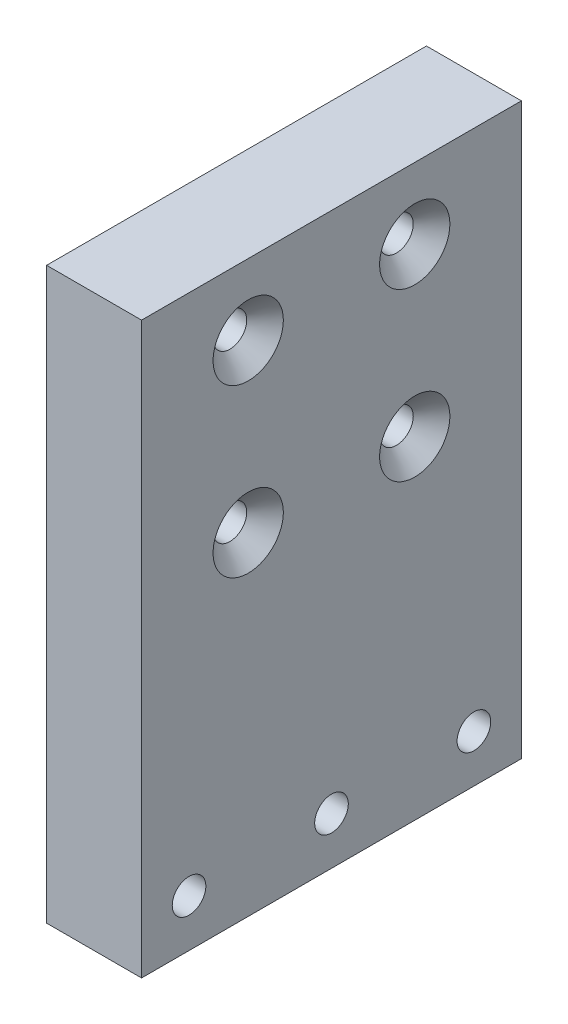
ISO-10303-21;
HEADER;
FILE_DESCRIPTION(('STEP AP214'),'2;1');
FILE_NAME('part.step','',(''),(''),'','','');
FILE_SCHEMA(('AUTOMOTIVE_DESIGN { 1 0 10303 214 1 1 1 1 }'));
ENDSEC;
DATA;
#1=APPLICATION_CONTEXT('core data for automotive mechanical design processes');
#2=APPLICATION_PROTOCOL_DEFINITION('international standard','automotive_design',2000,#1);
#3=PRODUCT_CONTEXT('',#1,'mechanical');
#4=PRODUCT('Part','Part','',(#3));
#5=PRODUCT_RELATED_PRODUCT_CATEGORY('part','',(#4));
#6=PRODUCT_DEFINITION_FORMATION('','',#4);
#7=PRODUCT_DEFINITION_CONTEXT('part definition',#1,'design');
#8=PRODUCT_DEFINITION('design','',#6,#7);
#9=PRODUCT_DEFINITION_SHAPE('','',#8);
#10=(LENGTH_UNIT() NAMED_UNIT(*) SI_UNIT(.MILLI.,.METRE.));
#11=(NAMED_UNIT(*) PLANE_ANGLE_UNIT() SI_UNIT($,.RADIAN.));
#12=(NAMED_UNIT(*) SI_UNIT($,.STERADIAN.) SOLID_ANGLE_UNIT());
#13=UNCERTAINTY_MEASURE_WITH_UNIT(LENGTH_MEASURE(1.E-05),#10,'distance_accuracy_value','');
#14=(GEOMETRIC_REPRESENTATION_CONTEXT(3) GLOBAL_UNCERTAINTY_ASSIGNED_CONTEXT((#13)) GLOBAL_UNIT_ASSIGNED_CONTEXT((#10,
#11,#12)) REPRESENTATION_CONTEXT('',''));
#15=CARTESIAN_POINT('',(0.,0.,0.));
#16=DIRECTION('',(0.,0.,1.));
#17=DIRECTION('',(1.,0.,0.));
#18=AXIS2_PLACEMENT_3D('',#15,#16,#17);
#19=CARTESIAN_POINT('',(12.7,-38.1,-25.4));
#20=DIRECTION('',(0.,0.,1.));
#21=DIRECTION('',(1.,0.,0.));
#22=AXIS2_PLACEMENT_3D('',#19,#20,#21);
#23=PLANE('',#22);
#24=DIRECTION('',(0.,1.,0.));
#25=VECTOR('',#24,1.);
#26=CARTESIAN_POINT('',(0.,-38.1,-25.4));
#27=LINE('',#26,#25);
#28=CARTESIAN_POINT('',(0.,-38.1,-25.4));
#29=VERTEX_POINT('',#28);
#30=CARTESIAN_POINT('',(0.,38.1,-25.4));
#31=VERTEX_POINT('',#30);
#32=EDGE_CURVE('E96',#29,#31,#27,.T.);
#33=ORIENTED_EDGE('',*,*,#32,.T.);
#34=DIRECTION('',(-1.,0.,0.));
#35=VECTOR('',#34,1.);
#36=CARTESIAN_POINT('',(12.7,38.1,-25.4));
#37=LINE('',#36,#35);
#38=CARTESIAN_POINT('',(12.7,38.1,-25.4));
#39=VERTEX_POINT('',#38);
#40=EDGE_CURVE('E11',#39,#31,#37,.T.);
#41=ORIENTED_EDGE('',*,*,#40,.F.);
#42=DIRECTION('',(0.,1.,0.));
#43=VECTOR('',#42,1.);
#44=CARTESIAN_POINT('',(12.7,-38.1,-25.4));
#45=LINE('',#44,#43);
#46=CARTESIAN_POINT('',(12.7,-38.1,-25.4));
#47=VERTEX_POINT('',#46);
#48=EDGE_CURVE('E84',#47,#39,#45,.T.);
#49=ORIENTED_EDGE('',*,*,#48,.F.);
#50=DIRECTION('',(-1.,0.,0.));
#51=VECTOR('',#50,1.);
#52=CARTESIAN_POINT('',(12.7,-38.1,-25.4));
#53=LINE('',#52,#51);
#54=EDGE_CURVE('E92',#47,#29,#53,.T.);
#55=ORIENTED_EDGE('',*,*,#54,.T.);
#56=EDGE_LOOP('',(#33,#41,#49,#55));
#57=FACE_BOUND('',#56,.T.);
#58=ADVANCED_FACE('F33',(#57),#23,.F.);
#59=CARTESIAN_POINT('',(12.7,38.1,25.4));
#60=DIRECTION('',(0.,-1.,0.));
#61=DIRECTION('',(0.,0.,-1.));
#62=AXIS2_PLACEMENT_3D('',#59,#60,#61);
#63=PLANE('',#62);
#64=DIRECTION('',(0.,0.,1.));
#65=VECTOR('',#64,1.);
#66=CARTESIAN_POINT('',(0.,38.1,25.4));
#67=LINE('',#66,#65);
#68=CARTESIAN_POINT('',(0.,38.1,25.4));
#69=VERTEX_POINT('',#68);
#70=EDGE_CURVE('E88',#31,#69,#67,.T.);
#71=ORIENTED_EDGE('',*,*,#70,.T.);
#72=DIRECTION('',(-1.,0.,0.));
#73=VECTOR('',#72,1.);
#74=CARTESIAN_POINT('',(12.7,38.1,25.4));
#75=LINE('',#74,#73);
#76=CARTESIAN_POINT('',(12.7,38.1,25.4));
#77=VERTEX_POINT('',#76);
#78=EDGE_CURVE('E41',#77,#69,#75,.T.);
#79=ORIENTED_EDGE('',*,*,#78,.F.);
#80=DIRECTION('',(0.,0.,1.));
#81=VECTOR('',#80,1.);
#82=CARTESIAN_POINT('',(12.7,38.1,25.4));
#83=LINE('',#82,#81);
#84=EDGE_CURVE('E79',#39,#77,#83,.T.);
#85=ORIENTED_EDGE('',*,*,#84,.F.);
#86=ORIENTED_EDGE('',*,*,#40,.T.);
#87=EDGE_LOOP('',(#71,#79,#85,#86));
#88=FACE_BOUND('',#87,.T.);
#89=ADVANCED_FACE('F87',(#88),#63,.F.);
#90=CARTESIAN_POINT('',(12.7,-38.1,25.4));
#91=DIRECTION('',(0.,0.,-1.));
#92=DIRECTION('',(-1.,0.,0.));
#93=AXIS2_PLACEMENT_3D('',#90,#91,#92);
#94=PLANE('',#93);
#95=DIRECTION('',(0.,-1.,0.));
#96=VECTOR('',#95,1.);
#97=CARTESIAN_POINT('',(0.,-38.1,25.4));
#98=LINE('',#97,#96);
#99=CARTESIAN_POINT('',(0.,-38.1,25.4));
#100=VERTEX_POINT('',#99);
#101=EDGE_CURVE('E66',#69,#100,#98,.T.);
#102=ORIENTED_EDGE('',*,*,#101,.T.);
#103=DIRECTION('',(-1.,0.,0.));
#104=VECTOR('',#103,1.);
#105=CARTESIAN_POINT('',(12.7,-38.1,25.4));
#106=LINE('',#105,#104);
#107=CARTESIAN_POINT('',(12.7,-38.1,25.4));
#108=VERTEX_POINT('',#107);
#109=EDGE_CURVE('E89',#108,#100,#106,.T.);
#110=ORIENTED_EDGE('',*,*,#109,.F.);
#111=DIRECTION('',(0.,-1.,0.));
#112=VECTOR('',#111,1.);
#113=CARTESIAN_POINT('',(12.7,-38.1,25.4));
#114=LINE('',#113,#112);
#115=EDGE_CURVE('E82',#77,#108,#114,.T.);
#116=ORIENTED_EDGE('',*,*,#115,.F.);
#117=ORIENTED_EDGE('',*,*,#78,.T.);
#118=EDGE_LOOP('',(#102,#110,#116,#117));
#119=FACE_BOUND('',#118,.T.);
#120=ADVANCED_FACE('F90',(#119),#94,.F.);
#121=CARTESIAN_POINT('',(12.7,-38.1,25.4));
#122=DIRECTION('',(0.,1.,0.));
#123=DIRECTION('',(0.,0.,1.));
#124=AXIS2_PLACEMENT_3D('',#121,#122,#123);
#125=PLANE('',#124);
#126=DIRECTION('',(0.,0.,-1.));
#127=VECTOR('',#126,1.);
#128=CARTESIAN_POINT('',(0.,-38.1,25.4));
#129=LINE('',#128,#127);
#130=EDGE_CURVE('E72',#100,#29,#129,.T.);
#131=ORIENTED_EDGE('',*,*,#130,.T.);
#132=ORIENTED_EDGE('',*,*,#54,.F.);
#133=DIRECTION('',(0.,0.,-1.));
#134=VECTOR('',#133,1.);
#135=CARTESIAN_POINT('',(12.7,-38.1,25.4));
#136=LINE('',#135,#134);
#137=EDGE_CURVE('E49',#108,#47,#136,.T.);
#138=ORIENTED_EDGE('',*,*,#137,.F.);
#139=ORIENTED_EDGE('',*,*,#109,.T.);
#140=EDGE_LOOP('',(#131,#132,#138,#139));
#141=FACE_BOUND('',#140,.T.);
#142=ADVANCED_FACE('F104',(#141),#125,.F.);
#143=CARTESIAN_POINT('',(12.7,0.,0.));
#144=DIRECTION('',(-1.,0.,0.));
#145=DIRECTION('',(0.,0.,1.));
#146=AXIS2_PLACEMENT_3D('',#143,#144,#145);
#147=PLANE('',#146);
#148=CARTESIAN_POINT('',(12.7,-31.75,-19.05));
#149=DIRECTION('',(-1.,0.,0.));
#150=DIRECTION('',(0.,0.,1.));
#151=AXIS2_PLACEMENT_3D('',#148,#149,#150);
#152=CIRCLE('',#151,2.24790000000001);
#153=CARTESIAN_POINT('',(12.7,-31.75,-16.8021));
#154=VERTEX_POINT('',#153);
#155=EDGE_CURVE('E169',#154,#154,#152,.T.);
#156=ORIENTED_EDGE('',*,*,#155,.T.);
#157=EDGE_LOOP('',(#156));
#158=FACE_BOUND('',#157,.T.);
#159=CARTESIAN_POINT('',(12.7,-31.75,0.));
#160=DIRECTION('',(-1.,0.,0.));
#161=DIRECTION('',(0.,0.,1.));
#162=AXIS2_PLACEMENT_3D('',#159,#160,#161);
#163=CIRCLE('',#162,2.24790000000001);
#164=CARTESIAN_POINT('',(12.7,-31.75,2.24790000000001));
#165=VERTEX_POINT('',#164);
#166=EDGE_CURVE('E157',#165,#165,#163,.T.);
#167=ORIENTED_EDGE('',*,*,#166,.T.);
#168=EDGE_LOOP('',(#167));
#169=FACE_BOUND('',#168,.T.);
#170=CARTESIAN_POINT('',(12.7,-31.75,19.05));
#171=DIRECTION('',(-1.,0.,0.));
#172=DIRECTION('',(0.,0.,1.));
#173=AXIS2_PLACEMENT_3D('',#170,#171,#172);
#174=CIRCLE('',#173,2.24790000000001);
#175=CARTESIAN_POINT('',(12.7,-31.75,21.2979));
#176=VERTEX_POINT('',#175);
#177=EDGE_CURVE('E145',#176,#176,#174,.T.);
#178=ORIENTED_EDGE('',*,*,#177,.T.);
#179=EDGE_LOOP('',(#178));
#180=FACE_BOUND('',#179,.T.);
#181=CARTESIAN_POINT('',(12.7,28.6238636073763,-11.1369318036881));
#182=DIRECTION('',(1.,0.,0.));
#183=DIRECTION('',(0.,0.,-1.));
#184=AXIS2_PLACEMENT_3D('',#181,#182,#183);
#185=CIRCLE('',#184,4.7);
#186=CARTESIAN_POINT('',(12.7,28.6238636073763,-15.8369318036881));
#187=VERTEX_POINT('',#186);
#188=EDGE_CURVE('E142',#187,#187,#185,.T.);
#189=ORIENTED_EDGE('',*,*,#188,.F.);
#190=EDGE_LOOP('',(#189));
#191=FACE_BOUND('',#190,.T.);
#192=CARTESIAN_POINT('',(12.7,28.6238636073763,11.1369318036881));
#193=DIRECTION('',(1.,0.,0.));
#194=DIRECTION('',(0.,0.,-1.));
#195=AXIS2_PLACEMENT_3D('',#192,#193,#194);
#196=CIRCLE('',#195,4.7);
#197=CARTESIAN_POINT('',(12.7,28.6238636073763,6.43693180368812));
#198=VERTEX_POINT('',#197);
#199=EDGE_CURVE('E133',#198,#198,#196,.T.);
#200=ORIENTED_EDGE('',*,*,#199,.F.);
#201=EDGE_LOOP('',(#200));
#202=FACE_BOUND('',#201,.T.);
#203=CARTESIAN_POINT('',(12.7,6.35000000000001,11.1369318036881));
#204=DIRECTION('',(1.,0.,0.));
#205=DIRECTION('',(0.,0.,-1.));
#206=AXIS2_PLACEMENT_3D('',#203,#204,#205);
#207=CIRCLE('',#206,4.7);
#208=CARTESIAN_POINT('',(12.7,6.35000000000001,6.43693180368812));
#209=VERTEX_POINT('',#208);
#210=EDGE_CURVE('E124',#209,#209,#207,.T.);
#211=ORIENTED_EDGE('',*,*,#210,.F.);
#212=EDGE_LOOP('',(#211));
#213=FACE_BOUND('',#212,.T.);
#214=CARTESIAN_POINT('',(12.7,6.35000000000001,-11.1369318036881));
#215=DIRECTION('',(1.,0.,0.));
#216=DIRECTION('',(0.,0.,-1.));
#217=AXIS2_PLACEMENT_3D('',#214,#215,#216);
#218=CIRCLE('',#217,4.7);
#219=CARTESIAN_POINT('',(12.7,6.35000000000001,-15.8369318036881));
#220=VERTEX_POINT('',#219);
#221=EDGE_CURVE('E115',#220,#220,#218,.T.);
#222=ORIENTED_EDGE('',*,*,#221,.F.);
#223=EDGE_LOOP('',(#222));
#224=FACE_BOUND('',#223,.T.);
#225=ORIENTED_EDGE('',*,*,#48,.T.);
#226=ORIENTED_EDGE('',*,*,#84,.T.);
#227=ORIENTED_EDGE('',*,*,#115,.T.);
#228=ORIENTED_EDGE('',*,*,#137,.T.);
#229=EDGE_LOOP('',(#225,#226,#227,#228));
#230=FACE_BOUND('',#229,.T.);
#231=ADVANCED_FACE('F80',(#158,#169,#180,#191,#202,#213,#224,#230),#147,.F.);
#232=CARTESIAN_POINT('',(0.,0.,0.));
#233=DIRECTION('',(-1.,0.,0.));
#234=DIRECTION('',(0.,0.,1.));
#235=AXIS2_PLACEMENT_3D('',#232,#233,#234);
#236=PLANE('',#235);
#237=CARTESIAN_POINT('',(0.,-31.75,-19.05));
#238=DIRECTION('',(-1.,0.,0.));
#239=DIRECTION('',(0.,0.,1.));
#240=AXIS2_PLACEMENT_3D('',#237,#238,#239);
#241=CIRCLE('',#240,4.76249999999999);
#242=CARTESIAN_POINT('',(0.,-31.75,-14.2875));
#243=VERTEX_POINT('',#242);
#244=EDGE_CURVE('E178',#243,#243,#241,.T.);
#245=ORIENTED_EDGE('',*,*,#244,.F.);
#246=EDGE_LOOP('',(#245));
#247=FACE_BOUND('',#246,.T.);
#248=CARTESIAN_POINT('',(0.,-31.75,0.));
#249=DIRECTION('',(-1.,0.,0.));
#250=DIRECTION('',(0.,0.,1.));
#251=AXIS2_PLACEMENT_3D('',#248,#249,#250);
#252=CIRCLE('',#251,4.76249999999999);
#253=CARTESIAN_POINT('',(0.,-31.75,4.76249999999999));
#254=VERTEX_POINT('',#253);
#255=EDGE_CURVE('E166',#254,#254,#252,.T.);
#256=ORIENTED_EDGE('',*,*,#255,.F.);
#257=EDGE_LOOP('',(#256));
#258=FACE_BOUND('',#257,.T.);
#259=CARTESIAN_POINT('',(0.,-31.75,19.05));
#260=DIRECTION('',(-1.,0.,0.));
#261=DIRECTION('',(0.,0.,1.));
#262=AXIS2_PLACEMENT_3D('',#259,#260,#261);
#263=CIRCLE('',#262,4.76249999999999);
#264=CARTESIAN_POINT('',(0.,-31.75,23.8125));
#265=VERTEX_POINT('',#264);
#266=EDGE_CURVE('E154',#265,#265,#263,.T.);
#267=ORIENTED_EDGE('',*,*,#266,.F.);
#268=EDGE_LOOP('',(#267));
#269=FACE_BOUND('',#268,.T.);
#270=CARTESIAN_POINT('',(0.,28.6238636073763,-11.1369318036881));
#271=DIRECTION('',(1.,0.,0.));
#272=DIRECTION('',(0.,0.,-1.));
#273=AXIS2_PLACEMENT_3D('',#270,#271,#272);
#274=CIRCLE('',#273,2.25);
#275=CARTESIAN_POINT('',(0.,28.6238636073763,-13.3869318036881));
#276=VERTEX_POINT('',#275);
#277=EDGE_CURVE('E136',#276,#276,#274,.T.);
#278=ORIENTED_EDGE('',*,*,#277,.T.);
#279=EDGE_LOOP('',(#278));
#280=FACE_BOUND('',#279,.T.);
#281=CARTESIAN_POINT('',(0.,28.6238636073763,11.1369318036881));
#282=DIRECTION('',(1.,0.,0.));
#283=DIRECTION('',(0.,0.,-1.));
#284=AXIS2_PLACEMENT_3D('',#281,#282,#283);
#285=CIRCLE('',#284,2.25);
#286=CARTESIAN_POINT('',(0.,28.6238636073763,8.88693180368812));
#287=VERTEX_POINT('',#286);
#288=EDGE_CURVE('E127',#287,#287,#285,.T.);
#289=ORIENTED_EDGE('',*,*,#288,.T.);
#290=EDGE_LOOP('',(#289));
#291=FACE_BOUND('',#290,.T.);
#292=CARTESIAN_POINT('',(0.,6.35000000000001,11.1369318036881));
#293=DIRECTION('',(1.,0.,0.));
#294=DIRECTION('',(0.,0.,-1.));
#295=AXIS2_PLACEMENT_3D('',#292,#293,#294);
#296=CIRCLE('',#295,2.25);
#297=CARTESIAN_POINT('',(0.,6.35000000000001,8.88693180368812));
#298=VERTEX_POINT('',#297);
#299=EDGE_CURVE('E118',#298,#298,#296,.T.);
#300=ORIENTED_EDGE('',*,*,#299,.T.);
#301=EDGE_LOOP('',(#300));
#302=FACE_BOUND('',#301,.T.);
#303=CARTESIAN_POINT('',(0.,6.35000000000001,-11.1369318036881));
#304=DIRECTION('',(1.,0.,0.));
#305=DIRECTION('',(0.,0.,-1.));
#306=AXIS2_PLACEMENT_3D('',#303,#304,#305);
#307=CIRCLE('',#306,2.25);
#308=CARTESIAN_POINT('',(0.,6.35000000000001,-13.3869318036881));
#309=VERTEX_POINT('',#308);
#310=EDGE_CURVE('E99',#309,#309,#307,.T.);
#311=ORIENTED_EDGE('',*,*,#310,.T.);
#312=EDGE_LOOP('',(#311));
#313=FACE_BOUND('',#312,.T.);
#314=ORIENTED_EDGE('',*,*,#32,.F.);
#315=ORIENTED_EDGE('',*,*,#130,.F.);
#316=ORIENTED_EDGE('',*,*,#101,.F.);
#317=ORIENTED_EDGE('',*,*,#70,.F.);
#318=EDGE_LOOP('',(#314,#315,#316,#317));
#319=FACE_BOUND('',#318,.T.);
#320=ADVANCED_FACE('F107',(#247,#258,#269,#280,#291,#302,#313,#319),#236,.T.);
#321=CARTESIAN_POINT('',(12.7,6.35000000000001,-11.1369318036881));
#322=DIRECTION('',(1.,0.,0.));
#323=DIRECTION('',(0.,0.,-1.));
#324=AXIS2_PLACEMENT_3D('',#321,#322,#323);
#325=CYLINDRICAL_SURFACE('',#324,2.25);
#326=ORIENTED_EDGE('',*,*,#310,.F.);
#327=EDGE_LOOP('',(#326));
#328=FACE_BOUND('',#327,.T.);
#329=CARTESIAN_POINT('',(10.25,6.35000000000001,-11.1369318036881));
#330=DIRECTION('',(1.,0.,0.));
#331=DIRECTION('',(0.,0.,-1.));
#332=AXIS2_PLACEMENT_3D('',#329,#330,#331);
#333=CIRCLE('',#332,2.25);
#334=CARTESIAN_POINT('',(10.25,6.35000000000001,-13.3869318036881));
#335=VERTEX_POINT('',#334);
#336=EDGE_CURVE('E112',#335,#335,#333,.T.);
#337=ORIENTED_EDGE('',*,*,#336,.T.);
#338=EDGE_LOOP('',(#337));
#339=FACE_BOUND('',#338,.T.);
#340=ADVANCED_FACE('F186',(#328,#339),#325,.F.);
#341=CARTESIAN_POINT('',(12.7,6.35000000000001,-11.1369318036881));
#342=DIRECTION('',(1.,0.,0.));
#343=DIRECTION('',(0.,0.,-1.));
#344=AXIS2_PLACEMENT_3D('',#341,#342,#343);
#345=CONICAL_SURFACE('',#344,4.7,0.785398163397448);
#346=ORIENTED_EDGE('',*,*,#336,.F.);
#347=EDGE_LOOP('',(#346));
#348=FACE_BOUND('',#347,.T.);
#349=ORIENTED_EDGE('',*,*,#221,.T.);
#350=EDGE_LOOP('',(#349));
#351=FACE_BOUND('',#350,.T.);
#352=ADVANCED_FACE('F202',(#348,#351),#345,.F.);
#353=CARTESIAN_POINT('',(12.7,6.35000000000001,11.1369318036881));
#354=DIRECTION('',(1.,0.,0.));
#355=DIRECTION('',(0.,0.,-1.));
#356=AXIS2_PLACEMENT_3D('',#353,#354,#355);
#357=CYLINDRICAL_SURFACE('',#356,2.25);
#358=ORIENTED_EDGE('',*,*,#299,.F.);
#359=EDGE_LOOP('',(#358));
#360=FACE_BOUND('',#359,.T.);
#361=CARTESIAN_POINT('',(10.25,6.35000000000001,11.1369318036881));
#362=DIRECTION('',(1.,0.,0.));
#363=DIRECTION('',(0.,0.,-1.));
#364=AXIS2_PLACEMENT_3D('',#361,#362,#363);
#365=CIRCLE('',#364,2.25);
#366=CARTESIAN_POINT('',(10.25,6.35000000000001,8.88693180368812));
#367=VERTEX_POINT('',#366);
#368=EDGE_CURVE('E121',#367,#367,#365,.T.);
#369=ORIENTED_EDGE('',*,*,#368,.T.);
#370=EDGE_LOOP('',(#369));
#371=FACE_BOUND('',#370,.T.);
#372=ADVANCED_FACE('F208',(#360,#371),#357,.F.);
#373=CARTESIAN_POINT('',(12.7,6.35000000000001,11.1369318036881));
#374=DIRECTION('',(1.,0.,0.));
#375=DIRECTION('',(0.,0.,-1.));
#376=AXIS2_PLACEMENT_3D('',#373,#374,#375);
#377=CONICAL_SURFACE('',#376,4.7,0.785398163397448);
#378=ORIENTED_EDGE('',*,*,#368,.F.);
#379=EDGE_LOOP('',(#378));
#380=FACE_BOUND('',#379,.T.);
#381=ORIENTED_EDGE('',*,*,#210,.T.);
#382=EDGE_LOOP('',(#381));
#383=FACE_BOUND('',#382,.T.);
#384=ADVANCED_FACE('F257',(#380,#383),#377,.F.);
#385=CARTESIAN_POINT('',(12.7,28.6238636073763,11.1369318036881));
#386=DIRECTION('',(1.,0.,0.));
#387=DIRECTION('',(0.,0.,-1.));
#388=AXIS2_PLACEMENT_3D('',#385,#386,#387);
#389=CYLINDRICAL_SURFACE('',#388,2.25);
#390=ORIENTED_EDGE('',*,*,#288,.F.);
#391=EDGE_LOOP('',(#390));
#392=FACE_BOUND('',#391,.T.);
#393=CARTESIAN_POINT('',(10.25,28.6238636073763,11.1369318036881));
#394=DIRECTION('',(1.,0.,0.));
#395=DIRECTION('',(0.,0.,-1.));
#396=AXIS2_PLACEMENT_3D('',#393,#394,#395);
#397=CIRCLE('',#396,2.25);
#398=CARTESIAN_POINT('',(10.25,28.6238636073763,8.88693180368812));
#399=VERTEX_POINT('',#398);
#400=EDGE_CURVE('E130',#399,#399,#397,.T.);
#401=ORIENTED_EDGE('',*,*,#400,.T.);
#402=EDGE_LOOP('',(#401));
#403=FACE_BOUND('',#402,.T.);
#404=ADVANCED_FACE('F267',(#392,#403),#389,.F.);
#405=CARTESIAN_POINT('',(12.7,28.6238636073763,11.1369318036881));
#406=DIRECTION('',(1.,0.,0.));
#407=DIRECTION('',(0.,0.,-1.));
#408=AXIS2_PLACEMENT_3D('',#405,#406,#407);
#409=CONICAL_SURFACE('',#408,4.7,0.785398163397448);
#410=ORIENTED_EDGE('',*,*,#400,.F.);
#411=EDGE_LOOP('',(#410));
#412=FACE_BOUND('',#411,.T.);
#413=ORIENTED_EDGE('',*,*,#199,.T.);
#414=EDGE_LOOP('',(#413));
#415=FACE_BOUND('',#414,.T.);
#416=ADVANCED_FACE('F277',(#412,#415),#409,.F.);
#417=CARTESIAN_POINT('',(12.7,28.6238636073763,-11.1369318036881));
#418=DIRECTION('',(1.,0.,0.));
#419=DIRECTION('',(0.,0.,-1.));
#420=AXIS2_PLACEMENT_3D('',#417,#418,#419);
#421=CYLINDRICAL_SURFACE('',#420,2.25);
#422=ORIENTED_EDGE('',*,*,#277,.F.);
#423=EDGE_LOOP('',(#422));
#424=FACE_BOUND('',#423,.T.);
#425=CARTESIAN_POINT('',(10.25,28.6238636073763,-11.1369318036881));
#426=DIRECTION('',(1.,0.,0.));
#427=DIRECTION('',(0.,0.,-1.));
#428=AXIS2_PLACEMENT_3D('',#425,#426,#427);
#429=CIRCLE('',#428,2.25);
#430=CARTESIAN_POINT('',(10.25,28.6238636073763,-13.3869318036881));
#431=VERTEX_POINT('',#430);
#432=EDGE_CURVE('E139',#431,#431,#429,.T.);
#433=ORIENTED_EDGE('',*,*,#432,.T.);
#434=EDGE_LOOP('',(#433));
#435=FACE_BOUND('',#434,.T.);
#436=ADVANCED_FACE('F287',(#424,#435),#421,.F.);
#437=CARTESIAN_POINT('',(12.7,28.6238636073763,-11.1369318036881));
#438=DIRECTION('',(1.,0.,0.));
#439=DIRECTION('',(0.,0.,-1.));
#440=AXIS2_PLACEMENT_3D('',#437,#438,#439);
#441=CONICAL_SURFACE('',#440,4.7,0.785398163397448);
#442=ORIENTED_EDGE('',*,*,#432,.F.);
#443=EDGE_LOOP('',(#442));
#444=FACE_BOUND('',#443,.T.);
#445=ORIENTED_EDGE('',*,*,#188,.T.);
#446=EDGE_LOOP('',(#445));
#447=FACE_BOUND('',#446,.T.);
#448=ADVANCED_FACE('F297',(#444,#447),#441,.F.);
#449=CARTESIAN_POINT('',(0.,-31.75,19.05));
#450=DIRECTION('',(-1.,0.,0.));
#451=DIRECTION('',(0.,0.,1.));
#452=AXIS2_PLACEMENT_3D('',#449,#450,#451);
#453=CYLINDRICAL_SURFACE('',#452,2.2479);
#454=ORIENTED_EDGE('',*,*,#177,.F.);
#455=EDGE_LOOP('',(#454));
#456=FACE_BOUND('',#455,.T.);
#457=CARTESIAN_POINT('',(2.667,-31.75,19.05));
#458=DIRECTION('',(-1.,0.,0.));
#459=DIRECTION('',(0.,0.,1.));
#460=AXIS2_PLACEMENT_3D('',#457,#458,#459);
#461=CIRCLE('',#460,2.2479);
#462=CARTESIAN_POINT('',(2.667,-31.75,21.2979));
#463=VERTEX_POINT('',#462);
#464=EDGE_CURVE('E148',#463,#463,#461,.T.);
#465=ORIENTED_EDGE('',*,*,#464,.T.);
#466=EDGE_LOOP('',(#465));
#467=FACE_BOUND('',#466,.T.);
#468=ADVANCED_FACE('F306',(#456,#467),#453,.F.);
#469=CARTESIAN_POINT('',(2.667,-29.5021,19.05));
#470=DIRECTION('',(1.,0.,0.));
#471=DIRECTION('',(0.,0.,-1.));
#472=AXIS2_PLACEMENT_3D('',#469,#470,#471);
#473=PLANE('',#472);
#474=ORIENTED_EDGE('',*,*,#464,.F.);
#475=EDGE_LOOP('',(#474));
#476=FACE_BOUND('',#475,.T.);
#477=CARTESIAN_POINT('',(2.667,-31.75,19.05));
#478=DIRECTION('',(-1.,0.,0.));
#479=DIRECTION('',(0.,0.,1.));
#480=AXIS2_PLACEMENT_3D('',#477,#478,#479);
#481=CIRCLE('',#480,4.7625);
#482=CARTESIAN_POINT('',(2.667,-31.75,23.8125));
#483=VERTEX_POINT('',#482);
#484=EDGE_CURVE('E151',#483,#483,#481,.T.);
#485=ORIENTED_EDGE('',*,*,#484,.T.);
#486=EDGE_LOOP('',(#485));
#487=FACE_BOUND('',#486,.T.);
#488=ADVANCED_FACE('F325',(#476,#487),#473,.F.);
#489=CARTESIAN_POINT('',(0.,-31.75,19.05));
#490=DIRECTION('',(-1.,0.,0.));
#491=DIRECTION('',(0.,0.,1.));
#492=AXIS2_PLACEMENT_3D('',#489,#490,#491);
#493=CYLINDRICAL_SURFACE('',#492,4.76249999999999);
#494=ORIENTED_EDGE('',*,*,#484,.F.);
#495=EDGE_LOOP('',(#494));
#496=FACE_BOUND('',#495,.T.);
#497=ORIENTED_EDGE('',*,*,#266,.T.);
#498=EDGE_LOOP('',(#497));
#499=FACE_BOUND('',#498,.T.);
#500=ADVANCED_FACE('F335',(#496,#499),#493,.F.);
#501=CARTESIAN_POINT('',(0.,-31.75,0.));
#502=DIRECTION('',(-1.,0.,0.));
#503=DIRECTION('',(0.,0.,1.));
#504=AXIS2_PLACEMENT_3D('',#501,#502,#503);
#505=CYLINDRICAL_SURFACE('',#504,2.2479);
#506=ORIENTED_EDGE('',*,*,#166,.F.);
#507=EDGE_LOOP('',(#506));
#508=FACE_BOUND('',#507,.T.);
#509=CARTESIAN_POINT('',(2.667,-31.75,0.));
#510=DIRECTION('',(-1.,0.,0.));
#511=DIRECTION('',(0.,0.,1.));
#512=AXIS2_PLACEMENT_3D('',#509,#510,#511);
#513=CIRCLE('',#512,2.2479);
#514=CARTESIAN_POINT('',(2.667,-31.75,2.2479));
#515=VERTEX_POINT('',#514);
#516=EDGE_CURVE('E160',#515,#515,#513,.T.);
#517=ORIENTED_EDGE('',*,*,#516,.T.);
#518=EDGE_LOOP('',(#517));
#519=FACE_BOUND('',#518,.T.);
#520=ADVANCED_FACE('F345',(#508,#519),#505,.F.);
#521=CARTESIAN_POINT('',(2.667,-29.5021,0.));
#522=DIRECTION('',(1.,0.,0.));
#523=DIRECTION('',(0.,0.,-1.));
#524=AXIS2_PLACEMENT_3D('',#521,#522,#523);
#525=PLANE('',#524);
#526=ORIENTED_EDGE('',*,*,#516,.F.);
#527=EDGE_LOOP('',(#526));
#528=FACE_BOUND('',#527,.T.);
#529=CARTESIAN_POINT('',(2.667,-31.75,0.));
#530=DIRECTION('',(-1.,0.,0.));
#531=DIRECTION('',(0.,0.,1.));
#532=AXIS2_PLACEMENT_3D('',#529,#530,#531);
#533=CIRCLE('',#532,4.7625);
#534=CARTESIAN_POINT('',(2.667,-31.75,4.7625));
#535=VERTEX_POINT('',#534);
#536=EDGE_CURVE('E163',#535,#535,#533,.T.);
#537=ORIENTED_EDGE('',*,*,#536,.T.);
#538=EDGE_LOOP('',(#537));
#539=FACE_BOUND('',#538,.T.);
#540=ADVANCED_FACE('F355',(#528,#539),#525,.F.);
#541=CARTESIAN_POINT('',(0.,-31.75,0.));
#542=DIRECTION('',(-1.,0.,0.));
#543=DIRECTION('',(0.,0.,1.));
#544=AXIS2_PLACEMENT_3D('',#541,#542,#543);
#545=CYLINDRICAL_SURFACE('',#544,4.76249999999999);
#546=ORIENTED_EDGE('',*,*,#536,.F.);
#547=EDGE_LOOP('',(#546));
#548=FACE_BOUND('',#547,.T.);
#549=ORIENTED_EDGE('',*,*,#255,.T.);
#550=EDGE_LOOP('',(#549));
#551=FACE_BOUND('',#550,.T.);
#552=ADVANCED_FACE('F365',(#548,#551),#545,.F.);
#553=CARTESIAN_POINT('',(0.,-31.75,-19.05));
#554=DIRECTION('',(-1.,0.,0.));
#555=DIRECTION('',(0.,0.,1.));
#556=AXIS2_PLACEMENT_3D('',#553,#554,#555);
#557=CYLINDRICAL_SURFACE('',#556,2.2479);
#558=ORIENTED_EDGE('',*,*,#155,.F.);
#559=EDGE_LOOP('',(#558));
#560=FACE_BOUND('',#559,.T.);
#561=CARTESIAN_POINT('',(2.667,-31.75,-19.05));
#562=DIRECTION('',(-1.,0.,0.));
#563=DIRECTION('',(0.,0.,1.));
#564=AXIS2_PLACEMENT_3D('',#561,#562,#563);
#565=CIRCLE('',#564,2.2479);
#566=CARTESIAN_POINT('',(2.667,-31.75,-16.8021));
#567=VERTEX_POINT('',#566);
#568=EDGE_CURVE('E172',#567,#567,#565,.T.);
#569=ORIENTED_EDGE('',*,*,#568,.T.);
#570=EDGE_LOOP('',(#569));
#571=FACE_BOUND('',#570,.T.);
#572=ADVANCED_FACE('F375',(#560,#571),#557,.F.);
#573=CARTESIAN_POINT('',(2.667,-29.5021,-19.05));
#574=DIRECTION('',(1.,0.,0.));
#575=DIRECTION('',(0.,0.,-1.));
#576=AXIS2_PLACEMENT_3D('',#573,#574,#575);
#577=PLANE('',#576);
#578=ORIENTED_EDGE('',*,*,#568,.F.);
#579=EDGE_LOOP('',(#578));
#580=FACE_BOUND('',#579,.T.);
#581=CARTESIAN_POINT('',(2.667,-31.75,-19.05));
#582=DIRECTION('',(-1.,0.,0.));
#583=DIRECTION('',(0.,0.,1.));
#584=AXIS2_PLACEMENT_3D('',#581,#582,#583);
#585=CIRCLE('',#584,4.7625);
#586=CARTESIAN_POINT('',(2.667,-31.75,-14.2875));
#587=VERTEX_POINT('',#586);
#588=EDGE_CURVE('E175',#587,#587,#585,.T.);
#589=ORIENTED_EDGE('',*,*,#588,.T.);
#590=EDGE_LOOP('',(#589));
#591=FACE_BOUND('',#590,.T.);
#592=ADVANCED_FACE('F385',(#580,#591),#577,.F.);
#593=CARTESIAN_POINT('',(0.,-31.75,-19.05));
#594=DIRECTION('',(-1.,0.,0.));
#595=DIRECTION('',(0.,0.,1.));
#596=AXIS2_PLACEMENT_3D('',#593,#594,#595);
#597=CYLINDRICAL_SURFACE('',#596,4.76249999999999);
#598=ORIENTED_EDGE('',*,*,#588,.F.);
#599=EDGE_LOOP('',(#598));
#600=FACE_BOUND('',#599,.T.);
#601=ORIENTED_EDGE('',*,*,#244,.T.);
#602=EDGE_LOOP('',(#601));
#603=FACE_BOUND('',#602,.T.);
#604=ADVANCED_FACE('F182',(#600,#603),#597,.F.);
#605=CLOSED_SHELL('',(#58,#89,#120,#142,#231,#320,#340,#352,#372,#384,#404,#416,#436,#448,#468,
#488,#500,#520,#540,#552,#572,#592,#604));
#606=MANIFOLD_SOLID_BREP('B2',#605);
#607=ADVANCED_BREP_SHAPE_REPRESENTATION('',(#18,#606),#14);
#608=SHAPE_DEFINITION_REPRESENTATION(#9,#607);
ENDSEC;
END-ISO-10303-21;
